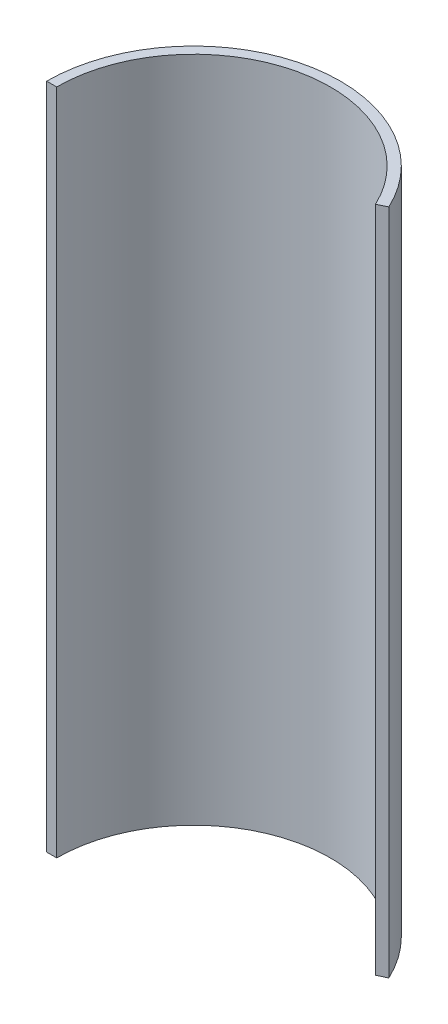
ISO-10303-21;
HEADER;
FILE_DESCRIPTION(('STEP AP214'),'2;1');
FILE_NAME('part.step','',(''),(''),'','','');
FILE_SCHEMA(('AUTOMOTIVE_DESIGN { 1 0 10303 214 1 1 1 1 }'));
ENDSEC;
DATA;
#1=APPLICATION_CONTEXT('core data for automotive mechanical design processes');
#2=APPLICATION_PROTOCOL_DEFINITION('international standard','automotive_design',2000,#1);
#3=PRODUCT_CONTEXT('',#1,'mechanical');
#4=PRODUCT('Part','Part','',(#3));
#5=PRODUCT_RELATED_PRODUCT_CATEGORY('part','',(#4));
#6=PRODUCT_DEFINITION_FORMATION('','',#4);
#7=PRODUCT_DEFINITION_CONTEXT('part definition',#1,'design');
#8=PRODUCT_DEFINITION('design','',#6,#7);
#9=PRODUCT_DEFINITION_SHAPE('','',#8);
#10=(LENGTH_UNIT() NAMED_UNIT(*) SI_UNIT(.MILLI.,.METRE.));
#11=(NAMED_UNIT(*) PLANE_ANGLE_UNIT() SI_UNIT($,.RADIAN.));
#12=(NAMED_UNIT(*) SI_UNIT($,.STERADIAN.) SOLID_ANGLE_UNIT());
#13=UNCERTAINTY_MEASURE_WITH_UNIT(LENGTH_MEASURE(1.E-05),#10,'distance_accuracy_value','');
#14=(GEOMETRIC_REPRESENTATION_CONTEXT(3) GLOBAL_UNCERTAINTY_ASSIGNED_CONTEXT((#13)) GLOBAL_UNIT_ASSIGNED_CONTEXT((#10,
#11,#12)) REPRESENTATION_CONTEXT('',''));
#15=CARTESIAN_POINT('',(0.,0.,0.));
#16=DIRECTION('',(0.,0.,1.));
#17=DIRECTION('',(1.,0.,0.));
#18=AXIS2_PLACEMENT_3D('',#15,#16,#17);
#19=CARTESIAN_POINT('',(0.,50.,0.));
#20=DIRECTION('',(0.,-1.,0.));
#21=DIRECTION('',(0.,0.,-1.));
#22=AXIS2_PLACEMENT_3D('',#19,#20,#21);
#23=CYLINDRICAL_SURFACE('',#22,20.5);
#24=CARTESIAN_POINT('',(0.,-50.,0.));
#25=DIRECTION('',(0.,-1.,0.));
#26=DIRECTION('',(0.,0.,1.));
#27=AXIS2_PLACEMENT_3D('',#24,#25,#26);
#28=CIRCLE('',#27,20.5);
#29=CARTESIAN_POINT('',(-20.5,-50.,0.));
#30=VERTEX_POINT('',#29);
#31=CARTESIAN_POINT('',(18.5793096342513,-50.,-8.66367436568437));
#32=VERTEX_POINT('',#31);
#33=EDGE_CURVE('E124',#30,#32,#28,.T.);
#34=ORIENTED_EDGE('',*,*,#33,.T.);
#35=DIRECTION('',(0.,-1.,0.));
#36=VECTOR('',#35,1.);
#37=CARTESIAN_POINT('',(18.5793096342513,50.,-8.66367436568437));
#38=LINE('',#37,#36);
#39=CARTESIAN_POINT('',(18.5793096342513,50.,-8.66367436568437));
#40=VERTEX_POINT('',#39);
#41=EDGE_CURVE('E50',#32,#40,#38,.F.);
#42=ORIENTED_EDGE('',*,*,#41,.T.);
#43=CARTESIAN_POINT('',(0.,50.,0.));
#44=DIRECTION('',(0.,-1.,0.));
#45=DIRECTION('',(0.,0.,1.));
#46=AXIS2_PLACEMENT_3D('',#43,#44,#45);
#47=CIRCLE('',#46,20.5);
#48=CARTESIAN_POINT('',(-20.5,50.,0.));
#49=VERTEX_POINT('',#48);
#50=EDGE_CURVE('E111',#49,#40,#47,.T.);
#51=ORIENTED_EDGE('',*,*,#50,.F.);
#52=DIRECTION('',(0.,-1.,0.));
#53=VECTOR('',#52,1.);
#54=CARTESIAN_POINT('',(-20.5,50.,0.));
#55=LINE('',#54,#53);
#56=EDGE_CURVE('E118',#49,#30,#55,.T.);
#57=ORIENTED_EDGE('',*,*,#56,.T.);
#58=EDGE_LOOP('',(#34,#42,#51,#57));
#59=FACE_BOUND('',#58,.T.);
#60=ADVANCED_FACE('F36',(#59),#23,.F.);
#61=CARTESIAN_POINT('',(0.,50.,0.));
#62=DIRECTION('',(0.,-1.,0.));
#63=DIRECTION('',(0.,0.,-1.));
#64=AXIS2_PLACEMENT_3D('',#61,#62,#63);
#65=CYLINDRICAL_SURFACE('',#64,22.);
#66=DIRECTION('',(0.,-1.,0.));
#67=VECTOR('',#66,1.);
#68=CARTESIAN_POINT('',(0.800000000000004,7.5,-21.9854497338581));
#69=LINE('',#68,#67);
#70=CARTESIAN_POINT('',(0.8,7.5,-21.9854497338581));
#71=VERTEX_POINT('',#70);
#72=CARTESIAN_POINT('',(0.8,-7.5,-21.9854497338581));
#73=VERTEX_POINT('',#72);
#74=EDGE_CURVE('E163',#71,#73,#69,.T.);
#75=ORIENTED_EDGE('',*,*,#74,.F.);
#76=CARTESIAN_POINT('',(0.,7.5,0.));
#77=DIRECTION('',(0.,-1.,0.));
#78=DIRECTION('',(0.,0.,1.));
#79=AXIS2_PLACEMENT_3D('',#76,#77,#78);
#80=CIRCLE('',#79,22.);
#81=CARTESIAN_POINT('',(-0.8,7.5,-21.9854497338581));
#82=VERTEX_POINT('',#81);
#83=EDGE_CURVE('E57',#82,#71,#80,.T.);
#84=ORIENTED_EDGE('',*,*,#83,.F.);
#85=DIRECTION('',(0.,-1.,0.));
#86=VECTOR('',#85,1.);
#87=CARTESIAN_POINT('',(-0.8,7.5,-21.9854497338581));
#88=LINE('',#87,#86);
#89=CARTESIAN_POINT('',(-0.8,-7.5,-21.9854497338581));
#90=VERTEX_POINT('',#89);
#91=EDGE_CURVE('E166',#82,#90,#88,.T.);
#92=ORIENTED_EDGE('',*,*,#91,.T.);
#93=CARTESIAN_POINT('',(0.,-7.5,0.));
#94=DIRECTION('',(0.,-1.,0.));
#95=DIRECTION('',(0.,0.,1.));
#96=AXIS2_PLACEMENT_3D('',#93,#94,#95);
#97=CIRCLE('',#96,22.);
#98=EDGE_CURVE('E158',#90,#73,#97,.T.);
#99=ORIENTED_EDGE('',*,*,#98,.T.);
#100=EDGE_LOOP('',(#75,#84,#92,#99));
#101=FACE_BOUND('',#100,.T.);
#102=CARTESIAN_POINT('',(0.,50.,0.));
#103=DIRECTION('',(0.,1.,0.));
#104=DIRECTION('',(0.,0.,1.));
#105=AXIS2_PLACEMENT_3D('',#102,#103,#104);
#106=CIRCLE('',#105,22.);
#107=CARTESIAN_POINT('',(19.9387713148063,50.,-9.29760175829542));
#108=VERTEX_POINT('',#107);
#109=CARTESIAN_POINT('',(-22.,50.,0.));
#110=VERTEX_POINT('',#109);
#111=EDGE_CURVE('E108',#108,#110,#106,.T.);
#112=ORIENTED_EDGE('',*,*,#111,.F.);
#113=DIRECTION('',(0.,-1.,0.));
#114=VECTOR('',#113,1.);
#115=CARTESIAN_POINT('',(19.9387713148063,50.,-9.29760175829542));
#116=LINE('',#115,#114);
#117=CARTESIAN_POINT('',(19.9387713148063,-50.,-9.29760175829542));
#118=VERTEX_POINT('',#117);
#119=EDGE_CURVE('E97',#108,#118,#116,.T.);
#120=ORIENTED_EDGE('',*,*,#119,.T.);
#121=CARTESIAN_POINT('',(0.,-50.,0.));
#122=DIRECTION('',(0.,1.,0.));
#123=DIRECTION('',(0.,0.,1.));
#124=AXIS2_PLACEMENT_3D('',#121,#122,#123);
#125=CIRCLE('',#124,22.);
#126=CARTESIAN_POINT('',(-22.,-50.,0.));
#127=VERTEX_POINT('',#126);
#128=EDGE_CURVE('E127',#118,#127,#125,.T.);
#129=ORIENTED_EDGE('',*,*,#128,.T.);
#130=DIRECTION('',(0.,-1.,0.));
#131=VECTOR('',#130,1.);
#132=CARTESIAN_POINT('',(-22.,50.,0.));
#133=LINE('',#132,#131);
#134=EDGE_CURVE('E43',#110,#127,#133,.T.);
#135=ORIENTED_EDGE('',*,*,#134,.F.);
#136=EDGE_LOOP('',(#112,#120,#129,#135));
#137=FACE_BOUND('',#136,.T.);
#138=ADVANCED_FACE('F113',(#101,#137),#65,.T.);
#139=CARTESIAN_POINT('',(-22.,50.,0.));
#140=DIRECTION('',(0.,0.,-1.));
#141=DIRECTION('',(-1.,0.,0.));
#142=AXIS2_PLACEMENT_3D('',#139,#140,#141);
#143=PLANE('',#142);
#144=DIRECTION('',(1.,0.,0.));
#145=VECTOR('',#144,1.);
#146=CARTESIAN_POINT('',(-22.,-50.,0.));
#147=LINE('',#146,#145);
#148=EDGE_CURVE('E120',#127,#30,#147,.T.);
#149=ORIENTED_EDGE('',*,*,#148,.T.);
#150=ORIENTED_EDGE('',*,*,#56,.F.);
#151=DIRECTION('',(1.,0.,0.));
#152=VECTOR('',#151,1.);
#153=CARTESIAN_POINT('',(-22.,50.,0.));
#154=LINE('',#153,#152);
#155=EDGE_CURVE('E116',#110,#49,#154,.T.);
#156=ORIENTED_EDGE('',*,*,#155,.F.);
#157=ORIENTED_EDGE('',*,*,#134,.T.);
#158=EDGE_LOOP('',(#149,#150,#156,#157));
#159=FACE_BOUND('',#158,.T.);
#160=ADVANCED_FACE('F134',(#159),#143,.F.);
#161=CARTESIAN_POINT('',(0.,50.,0.));
#162=DIRECTION('',(0.,1.,0.));
#163=DIRECTION('',(0.,0.,1.));
#164=AXIS2_PLACEMENT_3D('',#161,#162,#163);
#165=PLANE('',#164);
#166=DIRECTION('',(-0.906307787036649,0.,0.422618261740701));
#167=VECTOR('',#166,1.);
#168=CARTESIAN_POINT('',(0.,50.,0.));
#169=LINE('',#168,#167);
#170=EDGE_CURVE('E100',#108,#40,#169,.T.);
#171=ORIENTED_EDGE('',*,*,#170,.F.);
#172=ORIENTED_EDGE('',*,*,#111,.T.);
#173=ORIENTED_EDGE('',*,*,#155,.T.);
#174=ORIENTED_EDGE('',*,*,#50,.T.);
#175=EDGE_LOOP('',(#171,#172,#173,#174));
#176=FACE_BOUND('',#175,.T.);
#177=ADVANCED_FACE('F107',(#176),#165,.T.);
#178=CARTESIAN_POINT('',(0.,-50.,0.));
#179=DIRECTION('',(0.,1.,0.));
#180=DIRECTION('',(0.,0.,1.));
#181=AXIS2_PLACEMENT_3D('',#178,#179,#180);
#182=PLANE('',#181);
#183=ORIENTED_EDGE('',*,*,#128,.F.);
#184=DIRECTION('',(-0.906307787036649,0.,0.422618261740701));
#185=VECTOR('',#184,1.);
#186=CARTESIAN_POINT('',(0.,-50.,0.));
#187=LINE('',#186,#185);
#188=EDGE_CURVE('E11',#118,#32,#187,.T.);
#189=ORIENTED_EDGE('',*,*,#188,.T.);
#190=ORIENTED_EDGE('',*,*,#33,.F.);
#191=ORIENTED_EDGE('',*,*,#148,.F.);
#192=EDGE_LOOP('',(#183,#189,#190,#191));
#193=FACE_BOUND('',#192,.T.);
#194=ADVANCED_FACE('F138',(#193),#182,.F.);
#195=CARTESIAN_POINT('',(0.8,7.5,-22.8));
#196=DIRECTION('',(0.,0.,1.));
#197=DIRECTION('',(1.,0.,0.));
#198=AXIS2_PLACEMENT_3D('',#195,#196,#197);
#199=PLANE('',#198);
#200=DIRECTION('',(-1.,0.,0.));
#201=VECTOR('',#200,1.);
#202=CARTESIAN_POINT('',(0.8,-7.5,-22.8));
#203=LINE('',#202,#201);
#204=CARTESIAN_POINT('',(0.8,-7.5,-22.8));
#205=VERTEX_POINT('',#204);
#206=CARTESIAN_POINT('',(-0.8,-7.5,-22.8));
#207=VERTEX_POINT('',#206);
#208=EDGE_CURVE('E140',#205,#207,#203,.T.);
#209=ORIENTED_EDGE('',*,*,#208,.T.);
#210=DIRECTION('',(0.,-1.,0.));
#211=VECTOR('',#210,1.);
#212=CARTESIAN_POINT('',(-0.8,7.5,-22.8));
#213=LINE('',#212,#211);
#214=CARTESIAN_POINT('',(-0.8,7.5,-22.8));
#215=VERTEX_POINT('',#214);
#216=EDGE_CURVE('E128',#215,#207,#213,.T.);
#217=ORIENTED_EDGE('',*,*,#216,.F.);
#218=DIRECTION('',(-1.,0.,0.));
#219=VECTOR('',#218,1.);
#220=CARTESIAN_POINT('',(0.8,7.5,-22.8));
#221=LINE('',#220,#219);
#222=CARTESIAN_POINT('',(0.8,7.5,-22.8));
#223=VERTEX_POINT('',#222);
#224=EDGE_CURVE('E146',#223,#215,#221,.T.);
#225=ORIENTED_EDGE('',*,*,#224,.F.);
#226=DIRECTION('',(0.,-1.,0.));
#227=VECTOR('',#226,1.);
#228=CARTESIAN_POINT('',(0.8,7.5,-22.8));
#229=LINE('',#228,#227);
#230=EDGE_CURVE('E154',#223,#205,#229,.T.);
#231=ORIENTED_EDGE('',*,*,#230,.T.);
#232=EDGE_LOOP('',(#209,#217,#225,#231));
#233=FACE_BOUND('',#232,.T.);
#234=ADVANCED_FACE('F176',(#233),#199,.F.);
#235=CARTESIAN_POINT('',(-0.8,7.5,-22.8));
#236=DIRECTION('',(1.,0.,0.));
#237=DIRECTION('',(0.,0.,-1.));
#238=AXIS2_PLACEMENT_3D('',#235,#236,#237);
#239=PLANE('',#238);
#240=DIRECTION('',(0.,0.,1.));
#241=VECTOR('',#240,1.);
#242=CARTESIAN_POINT('',(-0.8,-7.5,-22.8));
#243=LINE('',#242,#241);
#244=EDGE_CURVE('E143',#207,#90,#243,.T.);
#245=ORIENTED_EDGE('',*,*,#244,.T.);
#246=ORIENTED_EDGE('',*,*,#91,.F.);
#247=DIRECTION('',(0.,0.,1.));
#248=VECTOR('',#247,1.);
#249=CARTESIAN_POINT('',(-0.8,7.5,-22.8));
#250=LINE('',#249,#248);
#251=EDGE_CURVE('E149',#215,#82,#250,.T.);
#252=ORIENTED_EDGE('',*,*,#251,.F.);
#253=ORIENTED_EDGE('',*,*,#216,.T.);
#254=EDGE_LOOP('',(#245,#246,#252,#253));
#255=FACE_BOUND('',#254,.T.);
#256=ADVANCED_FACE('F170',(#255),#239,.F.);
#257=CARTESIAN_POINT('',(0.8,7.5,-21.9854497338581));
#258=DIRECTION('',(-1.,0.,0.));
#259=DIRECTION('',(0.,0.,1.));
#260=AXIS2_PLACEMENT_3D('',#257,#258,#259);
#261=PLANE('',#260);
#262=DIRECTION('',(0.,0.,-1.));
#263=VECTOR('',#262,1.);
#264=CARTESIAN_POINT('',(0.8,-7.5,-21.9854497338581));
#265=LINE('',#264,#263);
#266=EDGE_CURVE('E150',#73,#205,#265,.T.);
#267=ORIENTED_EDGE('',*,*,#266,.T.);
#268=ORIENTED_EDGE('',*,*,#230,.F.);
#269=DIRECTION('',(0.,0.,-1.));
#270=VECTOR('',#269,1.);
#271=CARTESIAN_POINT('',(0.8,7.5,-21.9854497338581));
#272=LINE('',#271,#270);
#273=EDGE_CURVE('E153',#71,#223,#272,.T.);
#274=ORIENTED_EDGE('',*,*,#273,.F.);
#275=ORIENTED_EDGE('',*,*,#74,.T.);
#276=EDGE_LOOP('',(#267,#268,#274,#275));
#277=FACE_BOUND('',#276,.T.);
#278=ADVANCED_FACE('F183',(#277),#261,.F.);
#279=CARTESIAN_POINT('',(0.,7.5,0.));
#280=DIRECTION('',(0.,1.,0.));
#281=DIRECTION('',(0.,0.,1.));
#282=AXIS2_PLACEMENT_3D('',#279,#280,#281);
#283=PLANE('',#282);
#284=ORIENTED_EDGE('',*,*,#224,.T.);
#285=ORIENTED_EDGE('',*,*,#251,.T.);
#286=ORIENTED_EDGE('',*,*,#83,.T.);
#287=ORIENTED_EDGE('',*,*,#273,.T.);
#288=EDGE_LOOP('',(#284,#285,#286,#287));
#289=FACE_BOUND('',#288,.T.);
#290=ADVANCED_FACE('F185',(#289),#283,.T.);
#291=CARTESIAN_POINT('',(0.,-7.5,0.));
#292=DIRECTION('',(0.,1.,0.));
#293=DIRECTION('',(0.,0.,1.));
#294=AXIS2_PLACEMENT_3D('',#291,#292,#293);
#295=PLANE('',#294);
#296=ORIENTED_EDGE('',*,*,#208,.F.);
#297=ORIENTED_EDGE('',*,*,#266,.F.);
#298=ORIENTED_EDGE('',*,*,#98,.F.);
#299=ORIENTED_EDGE('',*,*,#244,.F.);
#300=EDGE_LOOP('',(#296,#297,#298,#299));
#301=FACE_BOUND('',#300,.T.);
#302=ADVANCED_FACE('F180',(#301),#295,.F.);
#303=CARTESIAN_POINT('',(0.,-50.,0.));
#304=DIRECTION('',(-0.422618261740701,0.,-0.906307787036649));
#305=DIRECTION('',(-0.906307787036649,0.,0.422618261740701));
#306=AXIS2_PLACEMENT_3D('',#303,#304,#305);
#307=PLANE('',#306);
#308=ORIENTED_EDGE('',*,*,#188,.F.);
#309=ORIENTED_EDGE('',*,*,#119,.F.);
#310=ORIENTED_EDGE('',*,*,#170,.T.);
#311=ORIENTED_EDGE('',*,*,#41,.F.);
#312=EDGE_LOOP('',(#308,#309,#310,#311));
#313=FACE_BOUND('',#312,.T.);
#314=ADVANCED_FACE('F99',(#313),#307,.F.);
#315=CLOSED_SHELL('',(#60,#138,#160,#177,#194,#234,#256,#278,#290,#302,#314));
#316=MANIFOLD_SOLID_BREP('B2',#315);
#317=ADVANCED_BREP_SHAPE_REPRESENTATION('',(#18,#316),#14);
#318=SHAPE_DEFINITION_REPRESENTATION(#9,#317);
ENDSEC;
END-ISO-10303-21;
